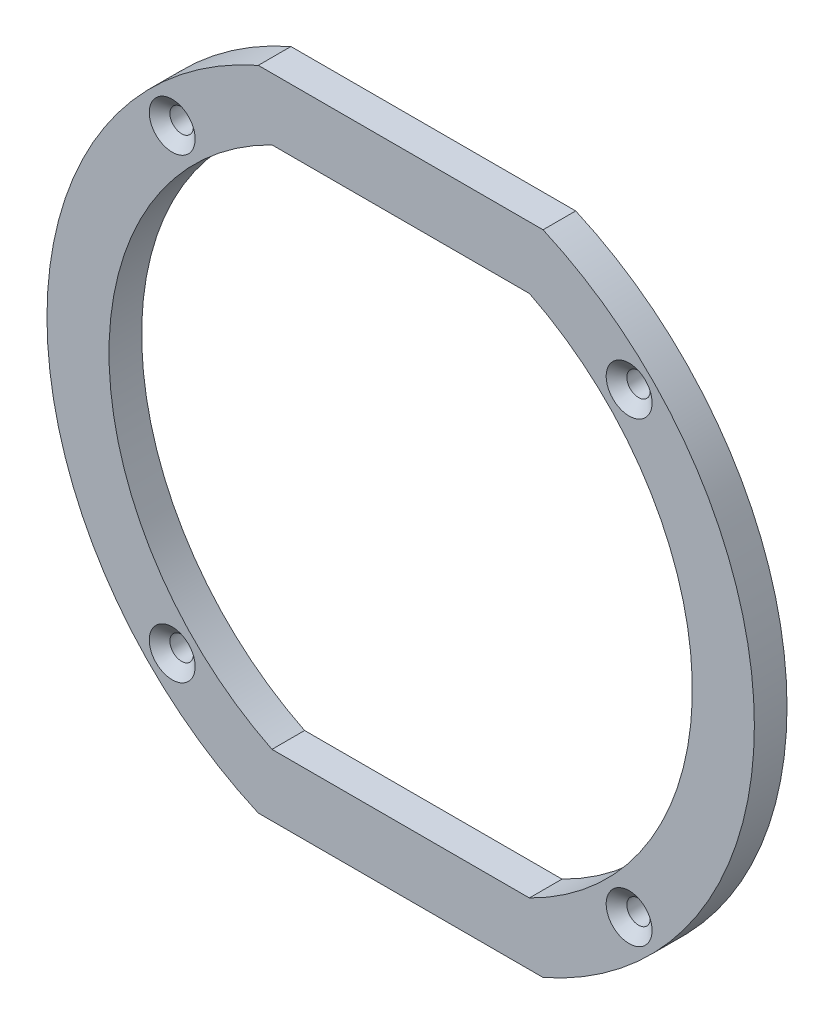
ISO-10303-21;
HEADER;
FILE_DESCRIPTION(('STEP AP214'),'2;1');
FILE_NAME('part.step','',(''),(''),'','','');
FILE_SCHEMA(('AUTOMOTIVE_DESIGN { 1 0 10303 214 1 1 1 1 }'));
ENDSEC;
DATA;
#1=APPLICATION_CONTEXT('core data for automotive mechanical design processes');
#2=APPLICATION_PROTOCOL_DEFINITION('international standard','automotive_design',2000,#1);
#3=PRODUCT_CONTEXT('',#1,'mechanical');
#4=PRODUCT('Part','Part','',(#3));
#5=PRODUCT_RELATED_PRODUCT_CATEGORY('part','',(#4));
#6=PRODUCT_DEFINITION_FORMATION('','',#4);
#7=PRODUCT_DEFINITION_CONTEXT('part definition',#1,'design');
#8=PRODUCT_DEFINITION('design','',#6,#7);
#9=PRODUCT_DEFINITION_SHAPE('','',#8);
#10=(LENGTH_UNIT() NAMED_UNIT(*) SI_UNIT(.MILLI.,.METRE.));
#11=(NAMED_UNIT(*) PLANE_ANGLE_UNIT() SI_UNIT($,.RADIAN.));
#12=(NAMED_UNIT(*) SI_UNIT($,.STERADIAN.) SOLID_ANGLE_UNIT());
#13=UNCERTAINTY_MEASURE_WITH_UNIT(LENGTH_MEASURE(1.E-05),#10,'distance_accuracy_value','');
#14=(GEOMETRIC_REPRESENTATION_CONTEXT(3) GLOBAL_UNCERTAINTY_ASSIGNED_CONTEXT((#13)) GLOBAL_UNIT_ASSIGNED_CONTEXT((#10,
#11,#12)) REPRESENTATION_CONTEXT('',''));
#15=CARTESIAN_POINT('',(0.,0.,0.));
#16=DIRECTION('',(0.,0.,1.));
#17=DIRECTION('',(1.,0.,0.));
#18=AXIS2_PLACEMENT_3D('',#15,#16,#17);
#19=CARTESIAN_POINT('',(0.,0.,6.));
#20=DIRECTION('',(0.,0.,1.));
#21=DIRECTION('',(1.,0.,0.));
#22=AXIS2_PLACEMENT_3D('',#19,#20,#21);
#23=PLANE('',#22);
#24=CARTESIAN_POINT('',(41.985,41.985,6.));
#25=DIRECTION('',(0.,0.,1.));
#26=DIRECTION('',(1.,0.,0.));
#27=AXIS2_PLACEMENT_3D('',#24,#25,#26);
#28=CIRCLE('',#27,4.2164);
#29=CARTESIAN_POINT('',(46.2014,41.985,6.));
#30=VERTEX_POINT('',#29);
#31=EDGE_CURVE('E358',#30,#30,#28,.T.);
#32=ORIENTED_EDGE('',*,*,#31,.F.);
#33=EDGE_LOOP('',(#32));
#34=FACE_BOUND('',#33,.T.);
#35=CARTESIAN_POINT('',(-41.985,-41.985,6.));
#36=DIRECTION('',(0.,0.,1.));
#37=DIRECTION('',(1.,0.,0.));
#38=AXIS2_PLACEMENT_3D('',#35,#36,#37);
#39=CIRCLE('',#38,4.2164);
#40=CARTESIAN_POINT('',(-37.7686,-41.985,6.));
#41=VERTEX_POINT('',#40);
#42=EDGE_CURVE('E351',#41,#41,#39,.T.);
#43=ORIENTED_EDGE('',*,*,#42,.F.);
#44=EDGE_LOOP('',(#43));
#45=FACE_BOUND('',#44,.T.);
#46=CARTESIAN_POINT('',(-41.985,41.985,6.));
#47=DIRECTION('',(0.,0.,1.));
#48=DIRECTION('',(1.,0.,0.));
#49=AXIS2_PLACEMENT_3D('',#46,#47,#48);
#50=CIRCLE('',#49,4.2164);
#51=CARTESIAN_POINT('',(-37.7686,41.985,6.));
#52=VERTEX_POINT('',#51);
#53=EDGE_CURVE('E344',#52,#52,#50,.T.);
#54=ORIENTED_EDGE('',*,*,#53,.F.);
#55=EDGE_LOOP('',(#54));
#56=FACE_BOUND('',#55,.T.);
#57=CARTESIAN_POINT('',(41.985,-41.985,6.));
#58=DIRECTION('',(0.,0.,1.));
#59=DIRECTION('',(1.,0.,0.));
#60=AXIS2_PLACEMENT_3D('',#57,#58,#59);
#61=CIRCLE('',#60,4.2164);
#62=CARTESIAN_POINT('',(46.2014,-41.985,6.));
#63=VERTEX_POINT('',#62);
#64=EDGE_CURVE('E335',#63,#63,#61,.T.);
#65=ORIENTED_EDGE('',*,*,#64,.F.);
#66=EDGE_LOOP('',(#65));
#67=FACE_BOUND('',#66,.T.);
#68=CARTESIAN_POINT('',(0.,0.,6.));
#69=DIRECTION('',(0.,0.,1.));
#70=DIRECTION('',(1.,0.,0.));
#71=AXIS2_PLACEMENT_3D('',#68,#69,#70);
#72=CIRCLE('',#71,65.);
#73=CARTESIAN_POINT('',(26.1677282162591,-59.5,6.));
#74=VERTEX_POINT('',#73);
#75=CARTESIAN_POINT('',(26.167728216259,59.5,6.));
#76=VERTEX_POINT('',#75);
#77=EDGE_CURVE('E141',#74,#76,#72,.T.);
#78=ORIENTED_EDGE('',*,*,#77,.T.);
#79=DIRECTION('',(-1.,0.,0.));
#80=VECTOR('',#79,1.);
#81=CARTESIAN_POINT('',(-26.167728216259,59.5,6.));
#82=LINE('',#81,#80);
#83=CARTESIAN_POINT('',(-26.167728216259,59.5,6.));
#84=VERTEX_POINT('',#83);
#85=EDGE_CURVE('E144',#76,#84,#82,.T.);
#86=ORIENTED_EDGE('',*,*,#85,.T.);
#87=CARTESIAN_POINT('',(0.,0.,6.));
#88=DIRECTION('',(0.,0.,1.));
#89=DIRECTION('',(1.,0.,0.));
#90=AXIS2_PLACEMENT_3D('',#87,#88,#89);
#91=CIRCLE('',#90,65.);
#92=CARTESIAN_POINT('',(-26.167728216259,-59.5,6.));
#93=VERTEX_POINT('',#92);
#94=EDGE_CURVE('E147',#84,#93,#91,.T.);
#95=ORIENTED_EDGE('',*,*,#94,.T.);
#96=DIRECTION('',(1.,0.,0.));
#97=VECTOR('',#96,1.);
#98=CARTESIAN_POINT('',(-26.167728216259,-59.5,6.));
#99=LINE('',#98,#97);
#100=EDGE_CURVE('E149',#93,#74,#99,.T.);
#101=ORIENTED_EDGE('',*,*,#100,.T.);
#102=EDGE_LOOP('',(#78,#86,#95,#101));
#103=FACE_BOUND('',#102,.T.);
#104=DIRECTION('',(-1.,0.,0.));
#105=VECTOR('',#104,1.);
#106=CARTESIAN_POINT('',(-23.6505813882027,48.1,6.));
#107=LINE('',#106,#105);
#108=CARTESIAN_POINT('',(23.6505813882027,48.1,6.));
#109=VERTEX_POINT('',#108);
#110=CARTESIAN_POINT('',(-23.6505813882027,48.1,6.));
#111=VERTEX_POINT('',#110);
#112=EDGE_CURVE('E111',#109,#111,#107,.T.);
#113=ORIENTED_EDGE('',*,*,#112,.F.);
#114=CARTESIAN_POINT('',(0.,0.,6.));
#115=DIRECTION('',(0.,0.,1.));
#116=DIRECTION('',(1.,0.,0.));
#117=AXIS2_PLACEMENT_3D('',#114,#115,#116);
#118=CIRCLE('',#117,53.6);
#119=CARTESIAN_POINT('',(23.6505813882027,-48.1,6.));
#120=VERTEX_POINT('',#119);
#121=EDGE_CURVE('E103',#120,#109,#118,.T.);
#122=ORIENTED_EDGE('',*,*,#121,.F.);
#123=DIRECTION('',(1.,0.,0.));
#124=VECTOR('',#123,1.);
#125=CARTESIAN_POINT('',(-23.6505813882027,-48.1,6.));
#126=LINE('',#125,#124);
#127=CARTESIAN_POINT('',(-23.6505813882027,-48.1,6.));
#128=VERTEX_POINT('',#127);
#129=EDGE_CURVE('E125',#128,#120,#126,.T.);
#130=ORIENTED_EDGE('',*,*,#129,.F.);
#131=CARTESIAN_POINT('',(0.,0.,6.));
#132=DIRECTION('',(0.,0.,1.));
#133=DIRECTION('',(1.,0.,0.));
#134=AXIS2_PLACEMENT_3D('',#131,#132,#133);
#135=CIRCLE('',#134,53.6);
#136=EDGE_CURVE('E123',#111,#128,#135,.T.);
#137=ORIENTED_EDGE('',*,*,#136,.F.);
#138=EDGE_LOOP('',(#113,#122,#130,#137));
#139=FACE_BOUND('',#138,.T.);
#140=ADVANCED_FACE('F38',(#34,#45,#56,#67,#103,#139),#23,.T.);
#141=CARTESIAN_POINT('',(0.,0.,0.));
#142=DIRECTION('',(0.,0.,1.));
#143=DIRECTION('',(1.,0.,0.));
#144=AXIS2_PLACEMENT_3D('',#141,#142,#143);
#145=PLANE('',#144);
#146=CARTESIAN_POINT('',(-59.2455,0.,0.));
#147=DIRECTION('',(0.,0.,1.));
#148=DIRECTION('',(1.,0.,0.));
#149=AXIS2_PLACEMENT_3D('',#146,#147,#148);
#150=CIRCLE('',#149,1.905);
#151=CARTESIAN_POINT('',(-57.3405,0.,0.));
#152=VERTEX_POINT('',#151);
#153=EDGE_CURVE('E11',#152,#152,#150,.F.);
#154=ORIENTED_EDGE('',*,*,#153,.F.);
#155=EDGE_LOOP('',(#154));
#156=FACE_BOUND('',#155,.T.);
#157=CARTESIAN_POINT('',(59.2455,0.,0.));
#158=DIRECTION('',(0.,0.,1.));
#159=DIRECTION('',(1.,0.,0.));
#160=AXIS2_PLACEMENT_3D('',#157,#158,#159);
#161=CIRCLE('',#160,1.905);
#162=CARTESIAN_POINT('',(61.1505,0.,0.));
#163=VERTEX_POINT('',#162);
#164=EDGE_CURVE('E46',#163,#163,#161,.F.);
#165=ORIENTED_EDGE('',*,*,#164,.F.);
#166=EDGE_LOOP('',(#165));
#167=FACE_BOUND('',#166,.T.);
#168=CARTESIAN_POINT('',(41.985,41.985,0.));
#169=DIRECTION('',(0.,0.,1.));
#170=DIRECTION('',(1.,0.,0.));
#171=AXIS2_PLACEMENT_3D('',#168,#169,#170);
#172=CIRCLE('',#171,2.15265);
#173=CARTESIAN_POINT('',(44.13765,41.985,0.));
#174=VERTEX_POINT('',#173);
#175=EDGE_CURVE('E182',#174,#174,#172,.T.);
#176=ORIENTED_EDGE('',*,*,#175,.T.);
#177=EDGE_LOOP('',(#176));
#178=FACE_BOUND('',#177,.T.);
#179=CARTESIAN_POINT('',(-41.985,-41.985,0.));
#180=DIRECTION('',(0.,0.,1.));
#181=DIRECTION('',(1.,0.,0.));
#182=AXIS2_PLACEMENT_3D('',#179,#180,#181);
#183=CIRCLE('',#182,2.15265);
#184=CARTESIAN_POINT('',(-39.83235,-41.985,0.));
#185=VERTEX_POINT('',#184);
#186=EDGE_CURVE('E186',#185,#185,#183,.T.);
#187=ORIENTED_EDGE('',*,*,#186,.T.);
#188=EDGE_LOOP('',(#187));
#189=FACE_BOUND('',#188,.T.);
#190=CARTESIAN_POINT('',(-41.985,41.985,0.));
#191=DIRECTION('',(0.,0.,1.));
#192=DIRECTION('',(1.,0.,0.));
#193=AXIS2_PLACEMENT_3D('',#190,#191,#192);
#194=CIRCLE('',#193,2.15265);
#195=CARTESIAN_POINT('',(-39.83235,41.985,0.));
#196=VERTEX_POINT('',#195);
#197=EDGE_CURVE('E190',#196,#196,#194,.T.);
#198=ORIENTED_EDGE('',*,*,#197,.T.);
#199=EDGE_LOOP('',(#198));
#200=FACE_BOUND('',#199,.T.);
#201=CARTESIAN_POINT('',(41.985,-41.985,0.));
#202=DIRECTION('',(0.,0.,1.));
#203=DIRECTION('',(1.,0.,0.));
#204=AXIS2_PLACEMENT_3D('',#201,#202,#203);
#205=CIRCLE('',#204,2.15265);
#206=CARTESIAN_POINT('',(44.13765,-41.985,0.));
#207=VERTEX_POINT('',#206);
#208=EDGE_CURVE('E131',#207,#207,#205,.T.);
#209=ORIENTED_EDGE('',*,*,#208,.T.);
#210=EDGE_LOOP('',(#209));
#211=FACE_BOUND('',#210,.T.);
#212=CARTESIAN_POINT('',(0.,0.,0.));
#213=DIRECTION('',(0.,0.,1.));
#214=DIRECTION('',(1.,0.,0.));
#215=AXIS2_PLACEMENT_3D('',#212,#213,#214);
#216=CIRCLE('',#215,65.);
#217=CARTESIAN_POINT('',(26.1677282162591,-59.5,0.));
#218=VERTEX_POINT('',#217);
#219=CARTESIAN_POINT('',(26.167728216259,59.5,0.));
#220=VERTEX_POINT('',#219);
#221=EDGE_CURVE('E119',#218,#220,#216,.T.);
#222=ORIENTED_EDGE('',*,*,#221,.F.);
#223=DIRECTION('',(1.,0.,0.));
#224=VECTOR('',#223,1.);
#225=CARTESIAN_POINT('',(-26.167728216259,-59.5,0.));
#226=LINE('',#225,#224);
#227=CARTESIAN_POINT('',(-26.167728216259,-59.5,0.));
#228=VERTEX_POINT('',#227);
#229=EDGE_CURVE('E145',#228,#218,#226,.T.);
#230=ORIENTED_EDGE('',*,*,#229,.F.);
#231=CARTESIAN_POINT('',(0.,0.,0.));
#232=DIRECTION('',(0.,0.,1.));
#233=DIRECTION('',(1.,0.,0.));
#234=AXIS2_PLACEMENT_3D('',#231,#232,#233);
#235=CIRCLE('',#234,65.);
#236=CARTESIAN_POINT('',(-26.167728216259,59.5,0.));
#237=VERTEX_POINT('',#236);
#238=EDGE_CURVE('E156',#237,#228,#235,.T.);
#239=ORIENTED_EDGE('',*,*,#238,.F.);
#240=DIRECTION('',(-1.,0.,0.));
#241=VECTOR('',#240,1.);
#242=CARTESIAN_POINT('',(-26.167728216259,59.5,0.));
#243=LINE('',#242,#241);
#244=EDGE_CURVE('E154',#220,#237,#243,.T.);
#245=ORIENTED_EDGE('',*,*,#244,.F.);
#246=EDGE_LOOP('',(#222,#230,#239,#245));
#247=FACE_BOUND('',#246,.T.);
#248=CARTESIAN_POINT('',(0.,0.,0.));
#249=DIRECTION('',(0.,0.,1.));
#250=DIRECTION('',(1.,0.,0.));
#251=AXIS2_PLACEMENT_3D('',#248,#249,#250);
#252=CIRCLE('',#251,53.6);
#253=CARTESIAN_POINT('',(23.6505813882027,-48.1,0.));
#254=VERTEX_POINT('',#253);
#255=CARTESIAN_POINT('',(23.6505813882027,48.1,0.));
#256=VERTEX_POINT('',#255);
#257=EDGE_CURVE('E61',#254,#256,#252,.T.);
#258=ORIENTED_EDGE('',*,*,#257,.T.);
#259=DIRECTION('',(-1.,0.,0.));
#260=VECTOR('',#259,1.);
#261=CARTESIAN_POINT('',(-23.6505813882027,48.1,0.));
#262=LINE('',#261,#260);
#263=CARTESIAN_POINT('',(-23.6505813882027,48.1,0.));
#264=VERTEX_POINT('',#263);
#265=EDGE_CURVE('E118',#256,#264,#262,.T.);
#266=ORIENTED_EDGE('',*,*,#265,.T.);
#267=CARTESIAN_POINT('',(0.,0.,0.));
#268=DIRECTION('',(0.,0.,1.));
#269=DIRECTION('',(1.,0.,0.));
#270=AXIS2_PLACEMENT_3D('',#267,#268,#269);
#271=CIRCLE('',#270,53.6);
#272=CARTESIAN_POINT('',(-23.6505813882027,-48.1,0.));
#273=VERTEX_POINT('',#272);
#274=EDGE_CURVE('E133',#264,#273,#271,.T.);
#275=ORIENTED_EDGE('',*,*,#274,.T.);
#276=DIRECTION('',(1.,0.,0.));
#277=VECTOR('',#276,1.);
#278=CARTESIAN_POINT('',(-23.6505813882027,-48.1,0.));
#279=LINE('',#278,#277);
#280=EDGE_CURVE('E112',#273,#254,#279,.T.);
#281=ORIENTED_EDGE('',*,*,#280,.T.);
#282=EDGE_LOOP('',(#258,#266,#275,#281));
#283=FACE_BOUND('',#282,.T.);
#284=ADVANCED_FACE('F174',(#156,#167,#178,#189,#200,#211,#247,#283),#145,.F.);
#285=CARTESIAN_POINT('',(0.,0.,6.));
#286=DIRECTION('',(0.,0.,-1.));
#287=DIRECTION('',(-1.,0.,0.));
#288=AXIS2_PLACEMENT_3D('',#285,#286,#287);
#289=CYLINDRICAL_SURFACE('',#288,65.);
#290=ORIENTED_EDGE('',*,*,#221,.T.);
#291=DIRECTION('',(0.,0.,-1.));
#292=VECTOR('',#291,1.);
#293=CARTESIAN_POINT('',(26.167728216259,59.5,6.));
#294=LINE('',#293,#292);
#295=EDGE_CURVE('E167',#76,#220,#294,.T.);
#296=ORIENTED_EDGE('',*,*,#295,.F.);
#297=ORIENTED_EDGE('',*,*,#77,.F.);
#298=DIRECTION('',(0.,0.,-1.));
#299=VECTOR('',#298,1.);
#300=CARTESIAN_POINT('',(26.1677282162591,-59.5,6.));
#301=LINE('',#300,#299);
#302=EDGE_CURVE('E151',#74,#218,#301,.T.);
#303=ORIENTED_EDGE('',*,*,#302,.T.);
#304=EDGE_LOOP('',(#290,#296,#297,#303));
#305=FACE_BOUND('',#304,.T.);
#306=ADVANCED_FACE('F40',(#305),#289,.T.);
#307=CARTESIAN_POINT('',(-26.167728216259,59.5,6.));
#308=DIRECTION('',(0.,-1.,0.));
#309=DIRECTION('',(1.,0.,0.));
#310=AXIS2_PLACEMENT_3D('',#307,#308,#309);
#311=PLANE('',#310);
#312=ORIENTED_EDGE('',*,*,#244,.T.);
#313=DIRECTION('',(0.,0.,-1.));
#314=VECTOR('',#313,1.);
#315=CARTESIAN_POINT('',(-26.167728216259,59.5,6.));
#316=LINE('',#315,#314);
#317=EDGE_CURVE('E164',#84,#237,#316,.T.);
#318=ORIENTED_EDGE('',*,*,#317,.F.);
#319=ORIENTED_EDGE('',*,*,#85,.F.);
#320=ORIENTED_EDGE('',*,*,#295,.T.);
#321=EDGE_LOOP('',(#312,#318,#319,#320));
#322=FACE_BOUND('',#321,.T.);
#323=ADVANCED_FACE('F228',(#322),#311,.F.);
#324=CARTESIAN_POINT('',(0.,0.,6.));
#325=DIRECTION('',(0.,0.,-1.));
#326=DIRECTION('',(-1.,0.,0.));
#327=AXIS2_PLACEMENT_3D('',#324,#325,#326);
#328=CYLINDRICAL_SURFACE('',#327,65.);
#329=ORIENTED_EDGE('',*,*,#238,.T.);
#330=DIRECTION('',(0.,0.,-1.));
#331=VECTOR('',#330,1.);
#332=CARTESIAN_POINT('',(-26.167728216259,-59.5,6.));
#333=LINE('',#332,#331);
#334=EDGE_CURVE('E161',#93,#228,#333,.T.);
#335=ORIENTED_EDGE('',*,*,#334,.F.);
#336=ORIENTED_EDGE('',*,*,#94,.F.);
#337=ORIENTED_EDGE('',*,*,#317,.T.);
#338=EDGE_LOOP('',(#329,#335,#336,#337));
#339=FACE_BOUND('',#338,.T.);
#340=ADVANCED_FACE('F225',(#339),#328,.T.);
#341=CARTESIAN_POINT('',(-26.167728216259,-59.5,6.));
#342=DIRECTION('',(0.,1.,0.));
#343=DIRECTION('',(-1.,0.,0.));
#344=AXIS2_PLACEMENT_3D('',#341,#342,#343);
#345=PLANE('',#344);
#346=ORIENTED_EDGE('',*,*,#229,.T.);
#347=ORIENTED_EDGE('',*,*,#302,.F.);
#348=ORIENTED_EDGE('',*,*,#100,.F.);
#349=ORIENTED_EDGE('',*,*,#334,.T.);
#350=EDGE_LOOP('',(#346,#347,#348,#349));
#351=FACE_BOUND('',#350,.T.);
#352=ADVANCED_FACE('F222',(#351),#345,.F.);
#353=CARTESIAN_POINT('',(0.,0.,6.));
#354=DIRECTION('',(0.,0.,-1.));
#355=DIRECTION('',(-1.,0.,0.));
#356=AXIS2_PLACEMENT_3D('',#353,#354,#355);
#357=CYLINDRICAL_SURFACE('',#356,53.6);
#358=ORIENTED_EDGE('',*,*,#257,.F.);
#359=DIRECTION('',(0.,0.,-1.));
#360=VECTOR('',#359,1.);
#361=CARTESIAN_POINT('',(23.6505813882027,-48.1,6.));
#362=LINE('',#361,#360);
#363=EDGE_CURVE('E107',#120,#254,#362,.T.);
#364=ORIENTED_EDGE('',*,*,#363,.F.);
#365=ORIENTED_EDGE('',*,*,#121,.T.);
#366=DIRECTION('',(0.,0.,-1.));
#367=VECTOR('',#366,1.);
#368=CARTESIAN_POINT('',(23.6505813882027,48.1,6.));
#369=LINE('',#368,#367);
#370=EDGE_CURVE('E106',#109,#256,#369,.T.);
#371=ORIENTED_EDGE('',*,*,#370,.T.);
#372=EDGE_LOOP('',(#358,#364,#365,#371));
#373=FACE_BOUND('',#372,.T.);
#374=ADVANCED_FACE('F105',(#373),#357,.F.);
#375=CARTESIAN_POINT('',(-23.6505813882027,48.1,6.));
#376=DIRECTION('',(0.,-1.,0.));
#377=DIRECTION('',(0.,0.,-1.));
#378=AXIS2_PLACEMENT_3D('',#375,#376,#377);
#379=PLANE('',#378);
#380=ORIENTED_EDGE('',*,*,#265,.F.);
#381=ORIENTED_EDGE('',*,*,#370,.F.);
#382=ORIENTED_EDGE('',*,*,#112,.T.);
#383=DIRECTION('',(0.,0.,-1.));
#384=VECTOR('',#383,1.);
#385=CARTESIAN_POINT('',(-23.6505813882027,48.1,6.));
#386=LINE('',#385,#384);
#387=EDGE_CURVE('E120',#111,#264,#386,.T.);
#388=ORIENTED_EDGE('',*,*,#387,.T.);
#389=EDGE_LOOP('',(#380,#381,#382,#388));
#390=FACE_BOUND('',#389,.T.);
#391=ADVANCED_FACE('F115',(#390),#379,.T.);
#392=CARTESIAN_POINT('',(0.,0.,6.));
#393=DIRECTION('',(0.,0.,-1.));
#394=DIRECTION('',(-1.,0.,0.));
#395=AXIS2_PLACEMENT_3D('',#392,#393,#394);
#396=CYLINDRICAL_SURFACE('',#395,53.6);
#397=ORIENTED_EDGE('',*,*,#274,.F.);
#398=ORIENTED_EDGE('',*,*,#387,.F.);
#399=ORIENTED_EDGE('',*,*,#136,.T.);
#400=DIRECTION('',(0.,0.,-1.));
#401=VECTOR('',#400,1.);
#402=CARTESIAN_POINT('',(-23.6505813882027,-48.1,6.));
#403=LINE('',#402,#401);
#404=EDGE_CURVE('E53',#128,#273,#403,.T.);
#405=ORIENTED_EDGE('',*,*,#404,.T.);
#406=EDGE_LOOP('',(#397,#398,#399,#405));
#407=FACE_BOUND('',#406,.T.);
#408=ADVANCED_FACE('F201',(#407),#396,.F.);
#409=CARTESIAN_POINT('',(-23.6505813882027,-48.1,6.));
#410=DIRECTION('',(0.,1.,0.));
#411=DIRECTION('',(0.,0.,1.));
#412=AXIS2_PLACEMENT_3D('',#409,#410,#411);
#413=PLANE('',#412);
#414=ORIENTED_EDGE('',*,*,#280,.F.);
#415=ORIENTED_EDGE('',*,*,#404,.F.);
#416=ORIENTED_EDGE('',*,*,#129,.T.);
#417=ORIENTED_EDGE('',*,*,#363,.T.);
#418=EDGE_LOOP('',(#414,#415,#416,#417));
#419=FACE_BOUND('',#418,.T.);
#420=ADVANCED_FACE('F198',(#419),#413,.T.);
#421=CARTESIAN_POINT('',(41.985,-41.985,6.));
#422=DIRECTION('',(0.,0.,1.));
#423=DIRECTION('',(1.,0.,0.));
#424=AXIS2_PLACEMENT_3D('',#421,#422,#423);
#425=CYLINDRICAL_SURFACE('',#424,2.15265);
#426=ORIENTED_EDGE('',*,*,#208,.F.);
#427=EDGE_LOOP('',(#426));
#428=FACE_BOUND('',#427,.T.);
#429=CARTESIAN_POINT('',(41.985,-41.985,4.26830813615789));
#430=DIRECTION('',(0.,0.,1.));
#431=DIRECTION('',(1.,0.,0.));
#432=AXIS2_PLACEMENT_3D('',#429,#430,#431);
#433=CIRCLE('',#432,2.15265);
#434=CARTESIAN_POINT('',(44.13765,-41.985,4.26830813615789));
#435=VERTEX_POINT('',#434);
#436=EDGE_CURVE('E332',#435,#435,#433,.T.);
#437=ORIENTED_EDGE('',*,*,#436,.T.);
#438=EDGE_LOOP('',(#437));
#439=FACE_BOUND('',#438,.T.);
#440=ADVANCED_FACE('F200',(#428,#439),#425,.F.);
#441=CARTESIAN_POINT('',(41.985,-41.985,6.));
#442=DIRECTION('',(0.,0.,1.));
#443=DIRECTION('',(1.,0.,0.));
#444=AXIS2_PLACEMENT_3D('',#441,#442,#443);
#445=CONICAL_SURFACE('',#444,4.2164,0.872664625997165);
#446=ORIENTED_EDGE('',*,*,#436,.F.);
#447=EDGE_LOOP('',(#446));
#448=FACE_BOUND('',#447,.T.);
#449=ORIENTED_EDGE('',*,*,#64,.T.);
#450=EDGE_LOOP('',(#449));
#451=FACE_BOUND('',#450,.T.);
#452=ADVANCED_FACE('F207',(#448,#451),#445,.F.);
#453=CARTESIAN_POINT('',(-41.985,41.985,6.));
#454=DIRECTION('',(0.,0.,1.));
#455=DIRECTION('',(1.,0.,0.));
#456=AXIS2_PLACEMENT_3D('',#453,#454,#455);
#457=CYLINDRICAL_SURFACE('',#456,2.15265);
#458=ORIENTED_EDGE('',*,*,#197,.F.);
#459=EDGE_LOOP('',(#458));
#460=FACE_BOUND('',#459,.T.);
#461=CARTESIAN_POINT('',(-41.985,41.985,4.26830813615789));
#462=DIRECTION('',(0.,0.,1.));
#463=DIRECTION('',(1.,0.,0.));
#464=AXIS2_PLACEMENT_3D('',#461,#462,#463);
#465=CIRCLE('',#464,2.15265);
#466=CARTESIAN_POINT('',(-39.83235,41.985,4.26830813615789));
#467=VERTEX_POINT('',#466);
#468=EDGE_CURVE('E339',#467,#467,#465,.T.);
#469=ORIENTED_EDGE('',*,*,#468,.T.);
#470=EDGE_LOOP('',(#469));
#471=FACE_BOUND('',#470,.T.);
#472=ADVANCED_FACE('F320',(#460,#471),#457,.F.);
#473=CARTESIAN_POINT('',(-41.985,41.985,6.));
#474=DIRECTION('',(0.,0.,1.));
#475=DIRECTION('',(1.,0.,0.));
#476=AXIS2_PLACEMENT_3D('',#473,#474,#475);
#477=CONICAL_SURFACE('',#476,4.2164,0.872664625997165);
#478=ORIENTED_EDGE('',*,*,#468,.F.);
#479=EDGE_LOOP('',(#478));
#480=FACE_BOUND('',#479,.T.);
#481=ORIENTED_EDGE('',*,*,#53,.T.);
#482=EDGE_LOOP('',(#481));
#483=FACE_BOUND('',#482,.T.);
#484=ADVANCED_FACE('F316',(#480,#483),#477,.F.);
#485=CARTESIAN_POINT('',(-41.985,-41.985,6.));
#486=DIRECTION('',(0.,0.,1.));
#487=DIRECTION('',(1.,0.,0.));
#488=AXIS2_PLACEMENT_3D('',#485,#486,#487);
#489=CYLINDRICAL_SURFACE('',#488,2.15265);
#490=ORIENTED_EDGE('',*,*,#186,.F.);
#491=EDGE_LOOP('',(#490));
#492=FACE_BOUND('',#491,.T.);
#493=CARTESIAN_POINT('',(-41.985,-41.985,4.26830813615789));
#494=DIRECTION('',(0.,0.,1.));
#495=DIRECTION('',(1.,0.,0.));
#496=AXIS2_PLACEMENT_3D('',#493,#494,#495);
#497=CIRCLE('',#496,2.15265);
#498=CARTESIAN_POINT('',(-39.83235,-41.985,4.26830813615789));
#499=VERTEX_POINT('',#498);
#500=EDGE_CURVE('E348',#499,#499,#497,.T.);
#501=ORIENTED_EDGE('',*,*,#500,.T.);
#502=EDGE_LOOP('',(#501));
#503=FACE_BOUND('',#502,.T.);
#504=ADVANCED_FACE('F312',(#492,#503),#489,.F.);
#505=CARTESIAN_POINT('',(-41.985,-41.985,6.));
#506=DIRECTION('',(0.,0.,1.));
#507=DIRECTION('',(1.,0.,0.));
#508=AXIS2_PLACEMENT_3D('',#505,#506,#507);
#509=CONICAL_SURFACE('',#508,4.2164,0.872664625997165);
#510=ORIENTED_EDGE('',*,*,#500,.F.);
#511=EDGE_LOOP('',(#510));
#512=FACE_BOUND('',#511,.T.);
#513=ORIENTED_EDGE('',*,*,#42,.T.);
#514=EDGE_LOOP('',(#513));
#515=FACE_BOUND('',#514,.T.);
#516=ADVANCED_FACE('F308',(#512,#515),#509,.F.);
#517=CARTESIAN_POINT('',(41.985,41.985,6.));
#518=DIRECTION('',(0.,0.,1.));
#519=DIRECTION('',(1.,0.,0.));
#520=AXIS2_PLACEMENT_3D('',#517,#518,#519);
#521=CYLINDRICAL_SURFACE('',#520,2.15265);
#522=ORIENTED_EDGE('',*,*,#175,.F.);
#523=EDGE_LOOP('',(#522));
#524=FACE_BOUND('',#523,.T.);
#525=CARTESIAN_POINT('',(41.985,41.985,4.26830813615789));
#526=DIRECTION('',(0.,0.,1.));
#527=DIRECTION('',(1.,0.,0.));
#528=AXIS2_PLACEMENT_3D('',#525,#526,#527);
#529=CIRCLE('',#528,2.15265);
#530=CARTESIAN_POINT('',(44.13765,41.985,4.26830813615789));
#531=VERTEX_POINT('',#530);
#532=EDGE_CURVE('E355',#531,#531,#529,.T.);
#533=ORIENTED_EDGE('',*,*,#532,.T.);
#534=EDGE_LOOP('',(#533));
#535=FACE_BOUND('',#534,.T.);
#536=ADVANCED_FACE('F304',(#524,#535),#521,.F.);
#537=CARTESIAN_POINT('',(41.985,41.985,6.));
#538=DIRECTION('',(0.,0.,1.));
#539=DIRECTION('',(1.,0.,0.));
#540=AXIS2_PLACEMENT_3D('',#537,#538,#539);
#541=CONICAL_SURFACE('',#540,4.2164,0.872664625997165);
#542=ORIENTED_EDGE('',*,*,#532,.F.);
#543=EDGE_LOOP('',(#542));
#544=FACE_BOUND('',#543,.T.);
#545=ORIENTED_EDGE('',*,*,#31,.T.);
#546=EDGE_LOOP('',(#545));
#547=FACE_BOUND('',#546,.T.);
#548=ADVANCED_FACE('F258',(#544,#547),#541,.F.);
#549=CARTESIAN_POINT('',(59.2455,0.,-2.5));
#550=DIRECTION('',(0.,0.,1.));
#551=DIRECTION('',(1.,0.,0.));
#552=AXIS2_PLACEMENT_3D('',#549,#550,#551);
#553=CYLINDRICAL_SURFACE('',#552,1.905);
#554=CARTESIAN_POINT('',(59.2455,0.,-2.5));
#555=DIRECTION('',(0.,0.,-1.));
#556=DIRECTION('',(-1.,0.,0.));
#557=AXIS2_PLACEMENT_3D('',#554,#555,#556);
#558=CIRCLE('',#557,1.905);
#559=CARTESIAN_POINT('',(57.3405,0.,-2.5));
#560=VERTEX_POINT('',#559);
#561=EDGE_CURVE('E361',#560,#560,#558,.T.);
#562=ORIENTED_EDGE('',*,*,#561,.F.);
#563=EDGE_LOOP('',(#562));
#564=FACE_BOUND('',#563,.T.);
#565=ORIENTED_EDGE('',*,*,#164,.T.);
#566=EDGE_LOOP('',(#565));
#567=FACE_BOUND('',#566,.T.);
#568=ADVANCED_FACE('F172',(#564,#567),#553,.T.);
#569=CARTESIAN_POINT('',(59.2455,0.,-2.5));
#570=DIRECTION('',(0.,0.,-1.));
#571=DIRECTION('',(-1.,0.,0.));
#572=AXIS2_PLACEMENT_3D('',#569,#570,#571);
#573=PLANE('',#572);
#574=ORIENTED_EDGE('',*,*,#561,.T.);
#575=EDGE_LOOP('',(#574));
#576=FACE_BOUND('',#575,.T.);
#577=ADVANCED_FACE('F267',(#576),#573,.T.);
#578=CARTESIAN_POINT('',(-59.2455,0.,-2.5));
#579=DIRECTION('',(0.,0.,1.));
#580=DIRECTION('',(1.,0.,0.));
#581=AXIS2_PLACEMENT_3D('',#578,#579,#580);
#582=CYLINDRICAL_SURFACE('',#581,1.905);
#583=CARTESIAN_POINT('',(-59.2455,0.,-2.5));
#584=DIRECTION('',(0.,0.,-1.));
#585=DIRECTION('',(-1.,0.,0.));
#586=AXIS2_PLACEMENT_3D('',#583,#584,#585);
#587=CIRCLE('',#586,1.905);
#588=CARTESIAN_POINT('',(-61.1505,0.,-2.5));
#589=VERTEX_POINT('',#588);
#590=EDGE_CURVE('E364',#589,#589,#587,.T.);
#591=ORIENTED_EDGE('',*,*,#590,.F.);
#592=EDGE_LOOP('',(#591));
#593=FACE_BOUND('',#592,.T.);
#594=ORIENTED_EDGE('',*,*,#153,.T.);
#595=EDGE_LOOP('',(#594));
#596=FACE_BOUND('',#595,.T.);
#597=ADVANCED_FACE('F277',(#593,#596),#582,.T.);
#598=CARTESIAN_POINT('',(-59.2455,0.,-2.5));
#599=DIRECTION('',(0.,0.,-1.));
#600=DIRECTION('',(-1.,0.,0.));
#601=AXIS2_PLACEMENT_3D('',#598,#599,#600);
#602=PLANE('',#601);
#603=ORIENTED_EDGE('',*,*,#590,.T.);
#604=EDGE_LOOP('',(#603));
#605=FACE_BOUND('',#604,.T.);
#606=ADVANCED_FACE('F287',(#605),#602,.T.);
#607=CLOSED_SHELL('',(#140,#284,#306,#323,#340,#352,#374,#391,#408,#420,#440,#452,#472,#484,
#504,#516,#536,#548,#568,#577,#597,#606));
#608=MANIFOLD_SOLID_BREP('B2',#607);
#609=ADVANCED_BREP_SHAPE_REPRESENTATION('',(#18,#608),#14);
#610=SHAPE_DEFINITION_REPRESENTATION(#9,#609);
ENDSEC;
END-ISO-10303-21;
